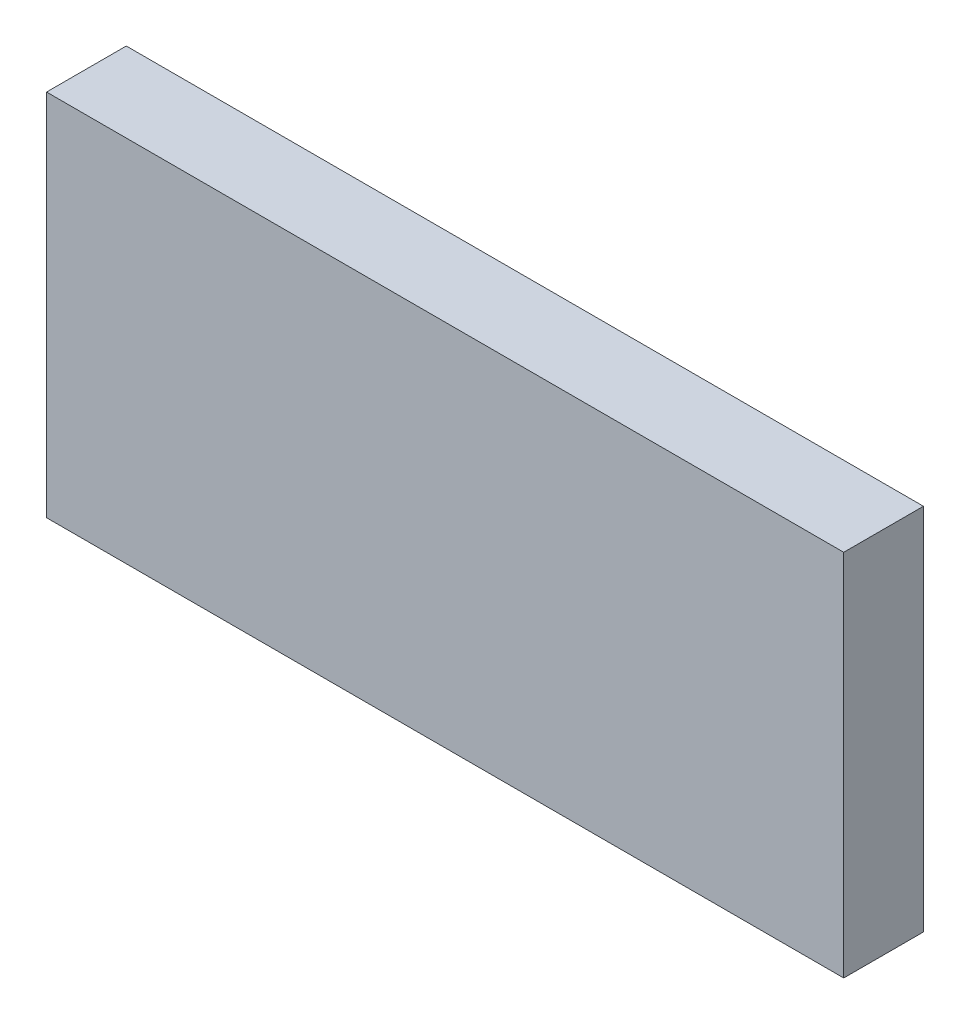
ISO-10303-21;
HEADER;
FILE_DESCRIPTION(('STEP AP214'),'2;1');
FILE_NAME('part.step','',(''),(''),'','','');
FILE_SCHEMA(('AUTOMOTIVE_DESIGN { 1 0 10303 214 1 1 1 1 }'));
ENDSEC;
DATA;
#1=APPLICATION_CONTEXT('core data for automotive mechanical design processes');
#2=APPLICATION_PROTOCOL_DEFINITION('international standard','automotive_design',2000,#1);
#3=PRODUCT_CONTEXT('',#1,'mechanical');
#4=PRODUCT('Part','Part','',(#3));
#5=PRODUCT_RELATED_PRODUCT_CATEGORY('part','',(#4));
#6=PRODUCT_DEFINITION_FORMATION('','',#4);
#7=PRODUCT_DEFINITION_CONTEXT('part definition',#1,'design');
#8=PRODUCT_DEFINITION('design','',#6,#7);
#9=PRODUCT_DEFINITION_SHAPE('','',#8);
#10=(LENGTH_UNIT() NAMED_UNIT(*) SI_UNIT(.MILLI.,.METRE.));
#11=(NAMED_UNIT(*) PLANE_ANGLE_UNIT() SI_UNIT($,.RADIAN.));
#12=(NAMED_UNIT(*) SI_UNIT($,.STERADIAN.) SOLID_ANGLE_UNIT());
#13=UNCERTAINTY_MEASURE_WITH_UNIT(LENGTH_MEASURE(1.E-05),#10,'distance_accuracy_value','');
#14=(GEOMETRIC_REPRESENTATION_CONTEXT(3) GLOBAL_UNCERTAINTY_ASSIGNED_CONTEXT((#13)) GLOBAL_UNIT_ASSIGNED_CONTEXT((#10,
#11,#12)) REPRESENTATION_CONTEXT('',''));
#15=CARTESIAN_POINT('',(0.,0.,0.));
#16=DIRECTION('',(0.,0.,1.));
#17=DIRECTION('',(1.,0.,0.));
#18=AXIS2_PLACEMENT_3D('',#15,#16,#17);
#19=CARTESIAN_POINT('',(20.,9.24999999999999,4.));
#20=DIRECTION('',(-1.,0.,0.));
#21=DIRECTION('',(0.,-1.,0.));
#22=AXIS2_PLACEMENT_3D('',#19,#20,#21);
#23=PLANE('',#22);
#24=DIRECTION('',(0.,1.,0.));
#25=VECTOR('',#24,1.);
#26=CARTESIAN_POINT('',(20.,9.24999999999999,0.));
#27=LINE('',#26,#25);
#28=CARTESIAN_POINT('',(20.,-9.24999999999999,0.));
#29=VERTEX_POINT('',#28);
#30=CARTESIAN_POINT('',(20.,9.24999999999999,0.));
#31=VERTEX_POINT('',#30);
#32=EDGE_CURVE('E107',#29,#31,#27,.T.);
#33=ORIENTED_EDGE('',*,*,#32,.T.);
#34=DIRECTION('',(0.,0.,-1.));
#35=VECTOR('',#34,1.);
#36=CARTESIAN_POINT('',(20.,9.24999999999999,4.));
#37=LINE('',#36,#35);
#38=CARTESIAN_POINT('',(20.,9.24999999999999,4.));
#39=VERTEX_POINT('',#38);
#40=EDGE_CURVE('E11',#39,#31,#37,.T.);
#41=ORIENTED_EDGE('',*,*,#40,.F.);
#42=DIRECTION('',(0.,1.,0.));
#43=VECTOR('',#42,1.);
#44=CARTESIAN_POINT('',(20.,9.24999999999999,4.));
#45=LINE('',#44,#43);
#46=CARTESIAN_POINT('',(20.,-9.24999999999999,4.));
#47=VERTEX_POINT('',#46);
#48=EDGE_CURVE('E91',#47,#39,#45,.T.);
#49=ORIENTED_EDGE('',*,*,#48,.F.);
#50=DIRECTION('',(0.,0.,-1.));
#51=VECTOR('',#50,1.);
#52=CARTESIAN_POINT('',(20.,-9.24999999999999,4.));
#53=LINE('',#52,#51);
#54=EDGE_CURVE('E103',#47,#29,#53,.T.);
#55=ORIENTED_EDGE('',*,*,#54,.T.);
#56=EDGE_LOOP('',(#33,#41,#49,#55));
#57=FACE_BOUND('',#56,.T.);
#58=ADVANCED_FACE('F39',(#57),#23,.F.);
#59=CARTESIAN_POINT('',(-20.,9.24999999999999,4.));
#60=DIRECTION('',(0.,-1.,0.));
#61=DIRECTION('',(0.,0.,-1.));
#62=AXIS2_PLACEMENT_3D('',#59,#60,#61);
#63=PLANE('',#62);
#64=DIRECTION('',(-1.,0.,0.));
#65=VECTOR('',#64,1.);
#66=CARTESIAN_POINT('',(-20.,9.24999999999999,0.));
#67=LINE('',#66,#65);
#68=CARTESIAN_POINT('',(-20.,9.24999999999999,0.));
#69=VERTEX_POINT('',#68);
#70=EDGE_CURVE('E96',#31,#69,#67,.T.);
#71=ORIENTED_EDGE('',*,*,#70,.T.);
#72=DIRECTION('',(0.,0.,-1.));
#73=VECTOR('',#72,1.);
#74=CARTESIAN_POINT('',(-20.,9.24999999999999,4.));
#75=LINE('',#74,#73);
#76=CARTESIAN_POINT('',(-20.,9.24999999999999,4.));
#77=VERTEX_POINT('',#76);
#78=EDGE_CURVE('E48',#77,#69,#75,.T.);
#79=ORIENTED_EDGE('',*,*,#78,.F.);
#80=DIRECTION('',(-1.,0.,0.));
#81=VECTOR('',#80,1.);
#82=CARTESIAN_POINT('',(-20.,9.24999999999999,4.));
#83=LINE('',#82,#81);
#84=EDGE_CURVE('E86',#39,#77,#83,.T.);
#85=ORIENTED_EDGE('',*,*,#84,.F.);
#86=ORIENTED_EDGE('',*,*,#40,.T.);
#87=EDGE_LOOP('',(#71,#79,#85,#86));
#88=FACE_BOUND('',#87,.T.);
#89=ADVANCED_FACE('F95',(#88),#63,.F.);
#90=CARTESIAN_POINT('',(-20.,9.24999999999999,4.));
#91=DIRECTION('',(1.,0.,0.));
#92=DIRECTION('',(0.,0.,-1.));
#93=AXIS2_PLACEMENT_3D('',#90,#91,#92);
#94=PLANE('',#93);
#95=DIRECTION('',(0.,-1.,0.));
#96=VECTOR('',#95,1.);
#97=CARTESIAN_POINT('',(-20.,9.24999999999999,0.));
#98=LINE('',#97,#96);
#99=CARTESIAN_POINT('',(-20.,-9.24999999999999,0.));
#100=VERTEX_POINT('',#99);
#101=EDGE_CURVE('E73',#69,#100,#98,.T.);
#102=ORIENTED_EDGE('',*,*,#101,.T.);
#103=DIRECTION('',(0.,0.,-1.));
#104=VECTOR('',#103,1.);
#105=CARTESIAN_POINT('',(-20.,-9.24999999999999,4.));
#106=LINE('',#105,#104);
#107=CARTESIAN_POINT('',(-20.,-9.24999999999999,4.));
#108=VERTEX_POINT('',#107);
#109=EDGE_CURVE('E98',#108,#100,#106,.T.);
#110=ORIENTED_EDGE('',*,*,#109,.F.);
#111=DIRECTION('',(0.,-1.,0.));
#112=VECTOR('',#111,1.);
#113=CARTESIAN_POINT('',(-20.,9.24999999999999,4.));
#114=LINE('',#113,#112);
#115=EDGE_CURVE('E89',#77,#108,#114,.T.);
#116=ORIENTED_EDGE('',*,*,#115,.F.);
#117=ORIENTED_EDGE('',*,*,#78,.T.);
#118=EDGE_LOOP('',(#102,#110,#116,#117));
#119=FACE_BOUND('',#118,.T.);
#120=ADVANCED_FACE('F99',(#119),#94,.F.);
#121=CARTESIAN_POINT('',(-20.,-9.24999999999999,4.));
#122=DIRECTION('',(0.,1.,0.));
#123=DIRECTION('',(0.,0.,1.));
#124=AXIS2_PLACEMENT_3D('',#121,#122,#123);
#125=PLANE('',#124);
#126=DIRECTION('',(1.,0.,0.));
#127=VECTOR('',#126,1.);
#128=CARTESIAN_POINT('',(-20.,-9.24999999999999,0.));
#129=LINE('',#128,#127);
#130=EDGE_CURVE('E79',#100,#29,#129,.T.);
#131=ORIENTED_EDGE('',*,*,#130,.T.);
#132=ORIENTED_EDGE('',*,*,#54,.F.);
#133=DIRECTION('',(1.,0.,0.));
#134=VECTOR('',#133,1.);
#135=CARTESIAN_POINT('',(-20.,-9.24999999999999,4.));
#136=LINE('',#135,#134);
#137=EDGE_CURVE('E56',#108,#47,#136,.T.);
#138=ORIENTED_EDGE('',*,*,#137,.F.);
#139=ORIENTED_EDGE('',*,*,#109,.T.);
#140=EDGE_LOOP('',(#131,#132,#138,#139));
#141=FACE_BOUND('',#140,.T.);
#142=ADVANCED_FACE('F120',(#141),#125,.F.);
#143=CARTESIAN_POINT('',(0.,0.,4.));
#144=DIRECTION('',(0.,0.,1.));
#145=DIRECTION('',(1.,0.,0.));
#146=AXIS2_PLACEMENT_3D('',#143,#144,#145);
#147=PLANE('',#146);
#148=ORIENTED_EDGE('',*,*,#48,.T.);
#149=ORIENTED_EDGE('',*,*,#84,.T.);
#150=ORIENTED_EDGE('',*,*,#115,.T.);
#151=ORIENTED_EDGE('',*,*,#137,.T.);
#152=EDGE_LOOP('',(#148,#149,#150,#151));
#153=FACE_BOUND('',#152,.T.);
#154=ADVANCED_FACE('F87',(#153),#147,.T.);
#155=CARTESIAN_POINT('',(0.,0.,0.));
#156=DIRECTION('',(0.,0.,1.));
#157=DIRECTION('',(1.,0.,0.));
#158=AXIS2_PLACEMENT_3D('',#155,#156,#157);
#159=PLANE('',#158);
#160=ORIENTED_EDGE('',*,*,#32,.F.);
#161=ORIENTED_EDGE('',*,*,#130,.F.);
#162=ORIENTED_EDGE('',*,*,#101,.F.);
#163=ORIENTED_EDGE('',*,*,#70,.F.);
#164=EDGE_LOOP('',(#160,#161,#162,#163));
#165=FACE_BOUND('',#164,.T.);
#166=ADVANCED_FACE('F123',(#165),#159,.F.);
#167=CLOSED_SHELL('',(#58,#89,#120,#142,#154,#166));
#168=MANIFOLD_SOLID_BREP('B2',#167);
#169=ADVANCED_BREP_SHAPE_REPRESENTATION('',(#18,#168),#14);
#170=SHAPE_DEFINITION_REPRESENTATION(#9,#169);
ENDSEC;
END-ISO-10303-21;
